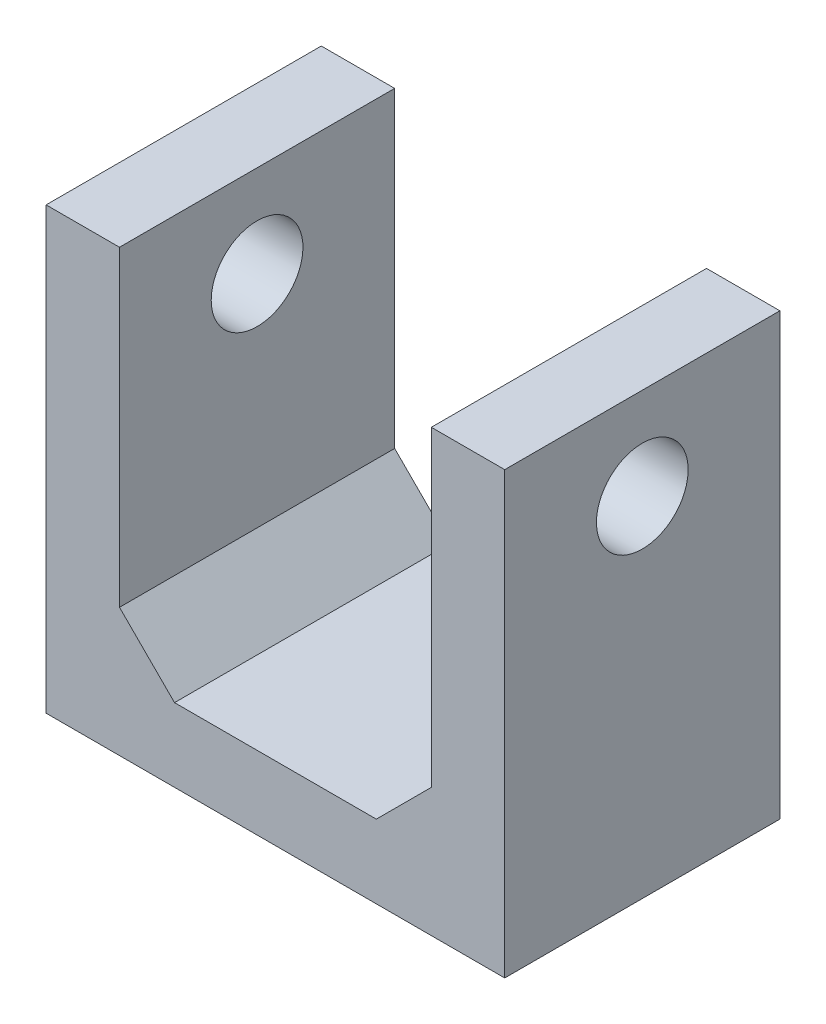
ISO-10303-21;
HEADER;
FILE_DESCRIPTION(('STEP AP214'),'2;1');
FILE_NAME('part.step','',(''),(''),'','','');
FILE_SCHEMA(('AUTOMOTIVE_DESIGN { 1 0 10303 214 1 1 1 1 }'));
ENDSEC;
DATA;
#1=APPLICATION_CONTEXT('core data for automotive mechanical design processes');
#2=APPLICATION_PROTOCOL_DEFINITION('international standard','automotive_design',2000,#1);
#3=PRODUCT_CONTEXT('',#1,'mechanical');
#4=PRODUCT('Part','Part','',(#3));
#5=PRODUCT_RELATED_PRODUCT_CATEGORY('part','',(#4));
#6=PRODUCT_DEFINITION_FORMATION('','',#4);
#7=PRODUCT_DEFINITION_CONTEXT('part definition',#1,'design');
#8=PRODUCT_DEFINITION('design','',#6,#7);
#9=PRODUCT_DEFINITION_SHAPE('','',#8);
#10=(LENGTH_UNIT() NAMED_UNIT(*) SI_UNIT(.MILLI.,.METRE.));
#11=(NAMED_UNIT(*) PLANE_ANGLE_UNIT() SI_UNIT($,.RADIAN.));
#12=(NAMED_UNIT(*) SI_UNIT($,.STERADIAN.) SOLID_ANGLE_UNIT());
#13=UNCERTAINTY_MEASURE_WITH_UNIT(LENGTH_MEASURE(1.E-05),#10,'distance_accuracy_value','');
#14=(GEOMETRIC_REPRESENTATION_CONTEXT(3) GLOBAL_UNCERTAINTY_ASSIGNED_CONTEXT((#13)) GLOBAL_UNIT_ASSIGNED_CONTEXT((#10,
#11,#12)) REPRESENTATION_CONTEXT('',''));
#15=CARTESIAN_POINT('',(0.,0.,0.));
#16=DIRECTION('',(0.,0.,1.));
#17=DIRECTION('',(1.,0.,0.));
#18=AXIS2_PLACEMENT_3D('',#15,#16,#17);
#19=CARTESIAN_POINT('',(0.,6.24929577464789,15.));
#20=DIRECTION('',(0.,1.,0.));
#21=DIRECTION('',(0.,0.,1.));
#22=AXIS2_PLACEMENT_3D('',#19,#20,#21);
#23=PLANE('',#22);
#24=DIRECTION('',(1.,0.,0.));
#25=VECTOR('',#24,1.);
#26=CARTESIAN_POINT('',(0.,6.24929577464789,0.));
#27=LINE('',#26,#25);
#28=CARTESIAN_POINT('',(8.11788248873083,6.24929577464789,0.));
#29=VERTEX_POINT('',#28);
#30=CARTESIAN_POINT('',(12.1178824887308,6.24929577464789,0.));
#31=VERTEX_POINT('',#30);
#32=EDGE_CURVE('E132',#29,#31,#27,.T.);
#33=ORIENTED_EDGE('',*,*,#32,.F.);
#34=DIRECTION('',(0.,0.,-1.));
#35=VECTOR('',#34,1.);
#36=CARTESIAN_POINT('',(8.11788248873083,6.24929577464789,15.));
#37=LINE('',#36,#35);
#38=CARTESIAN_POINT('',(8.11788248873083,6.24929577464789,15.));
#39=VERTEX_POINT('',#38);
#40=EDGE_CURVE('E127',#39,#29,#37,.T.);
#41=ORIENTED_EDGE('',*,*,#40,.F.);
#42=DIRECTION('',(1.,0.,0.));
#43=VECTOR('',#42,1.);
#44=CARTESIAN_POINT('',(0.,6.24929577464789,15.));
#45=LINE('',#44,#43);
#46=CARTESIAN_POINT('',(12.1178824887308,6.24929577464789,15.));
#47=VERTEX_POINT('',#46);
#48=EDGE_CURVE('E129',#39,#47,#45,.T.);
#49=ORIENTED_EDGE('',*,*,#48,.T.);
#50=DIRECTION('',(0.,0.,-1.));
#51=VECTOR('',#50,1.);
#52=CARTESIAN_POINT('',(12.1178824887308,6.24929577464789,15.));
#53=LINE('',#52,#51);
#54=EDGE_CURVE('E177',#47,#31,#53,.T.);
#55=ORIENTED_EDGE('',*,*,#54,.T.);
#56=EDGE_LOOP('',(#33,#41,#49,#55));
#57=FACE_BOUND('',#56,.T.);
#58=ADVANCED_FACE('F47',(#57),#23,.T.);
#59=CARTESIAN_POINT('',(8.11788248873083,0.,15.));
#60=DIRECTION('',(1.,0.,0.));
#61=DIRECTION('',(0.,1.,0.));
#62=AXIS2_PLACEMENT_3D('',#59,#60,#61);
#63=PLANE('',#62);
#64=CARTESIAN_POINT('',(8.11788248873083,1.24929577464789,7.5));
#65=DIRECTION('',(1.,0.,0.));
#66=DIRECTION('',(0.,1.,0.));
#67=AXIS2_PLACEMENT_3D('',#64,#65,#66);
#68=CIRCLE('',#67,2.5);
#69=CARTESIAN_POINT('',(8.11788248873083,3.74929577464789,7.5));
#70=VERTEX_POINT('',#69);
#71=EDGE_CURVE('E155',#70,#70,#68,.T.);
#72=ORIENTED_EDGE('',*,*,#71,.T.);
#73=EDGE_LOOP('',(#72));
#74=FACE_BOUND('',#73,.T.);
#75=DIRECTION('',(0.,-1.,0.));
#76=VECTOR('',#75,1.);
#77=CARTESIAN_POINT('',(8.11788248873083,0.,0.));
#78=LINE('',#77,#76);
#79=CARTESIAN_POINT('',(8.11788248873084,-10.7507042253521,0.));
#80=VERTEX_POINT('',#79);
#81=EDGE_CURVE('E180',#29,#80,#78,.T.);
#82=ORIENTED_EDGE('',*,*,#81,.T.);
#83=DIRECTION('',(0.,0.,1.));
#84=VECTOR('',#83,1.);
#85=CARTESIAN_POINT('',(8.11788248873084,-10.7507042253521,15.));
#86=LINE('',#85,#84);
#87=CARTESIAN_POINT('',(8.11788248873084,-10.7507042253521,15.));
#88=VERTEX_POINT('',#87);
#89=EDGE_CURVE('E65',#80,#88,#86,.T.);
#90=ORIENTED_EDGE('',*,*,#89,.T.);
#91=DIRECTION('',(0.,-1.,0.));
#92=VECTOR('',#91,1.);
#93=CARTESIAN_POINT('',(8.11788248873083,0.,15.));
#94=LINE('',#93,#92);
#95=EDGE_CURVE('E137',#39,#88,#94,.T.);
#96=ORIENTED_EDGE('',*,*,#95,.F.);
#97=ORIENTED_EDGE('',*,*,#40,.T.);
#98=EDGE_LOOP('',(#82,#90,#96,#97));
#99=FACE_BOUND('',#98,.T.);
#100=ADVANCED_FACE('F138',(#74,#99),#63,.F.);
#101=CARTESIAN_POINT('',(0.,-13.7507042253521,15.));
#102=DIRECTION('',(0.,1.,0.));
#103=DIRECTION('',(0.,0.,1.));
#104=AXIS2_PLACEMENT_3D('',#101,#102,#103);
#105=PLANE('',#104);
#106=DIRECTION('',(1.,0.,0.));
#107=VECTOR('',#106,1.);
#108=CARTESIAN_POINT('',(0.,-13.7507042253521,15.));
#109=LINE('',#108,#107);
#110=CARTESIAN_POINT('',(-5.88211751126918,-13.7507042253521,15.));
#111=VERTEX_POINT('',#110);
#112=CARTESIAN_POINT('',(5.11788248873081,-13.7507042253521,15.));
#113=VERTEX_POINT('',#112);
#114=EDGE_CURVE('E142',#111,#113,#109,.T.);
#115=ORIENTED_EDGE('',*,*,#114,.T.);
#116=DIRECTION('',(0.,0.,-1.));
#117=VECTOR('',#116,1.);
#118=CARTESIAN_POINT('',(5.11788248873081,-13.7507042253521,15.));
#119=LINE('',#118,#117);
#120=CARTESIAN_POINT('',(5.11788248873081,-13.7507042253521,0.));
#121=VERTEX_POINT('',#120);
#122=EDGE_CURVE('E226',#113,#121,#119,.T.);
#123=ORIENTED_EDGE('',*,*,#122,.T.);
#124=DIRECTION('',(1.,0.,0.));
#125=VECTOR('',#124,1.);
#126=CARTESIAN_POINT('',(0.,-13.7507042253521,0.));
#127=LINE('',#126,#125);
#128=CARTESIAN_POINT('',(-5.88211751126918,-13.7507042253521,0.));
#129=VERTEX_POINT('',#128);
#130=EDGE_CURVE('E183',#129,#121,#127,.T.);
#131=ORIENTED_EDGE('',*,*,#130,.F.);
#132=DIRECTION('',(0.,0.,1.));
#133=VECTOR('',#132,1.);
#134=CARTESIAN_POINT('',(-5.88211751126918,-13.7507042253521,15.));
#135=LINE('',#134,#133);
#136=EDGE_CURVE('E217',#129,#111,#135,.T.);
#137=ORIENTED_EDGE('',*,*,#136,.T.);
#138=EDGE_LOOP('',(#115,#123,#131,#137));
#139=FACE_BOUND('',#138,.T.);
#140=ADVANCED_FACE('F236',(#139),#105,.T.);
#141=CARTESIAN_POINT('',(-8.88211751126917,0.,15.));
#142=DIRECTION('',(1.,0.,0.));
#143=DIRECTION('',(0.,1.,0.));
#144=AXIS2_PLACEMENT_3D('',#141,#142,#143);
#145=PLANE('',#144);
#146=CARTESIAN_POINT('',(-8.88211751126917,1.24929577464789,7.5));
#147=DIRECTION('',(1.,0.,0.));
#148=DIRECTION('',(0.,1.,0.));
#149=AXIS2_PLACEMENT_3D('',#146,#147,#148);
#150=CIRCLE('',#149,2.5);
#151=CARTESIAN_POINT('',(-8.88211751126917,3.74929577464789,7.5));
#152=VERTEX_POINT('',#151);
#153=EDGE_CURVE('E383',#152,#152,#150,.T.);
#154=ORIENTED_EDGE('',*,*,#153,.F.);
#155=EDGE_LOOP('',(#154));
#156=FACE_BOUND('',#155,.T.);
#157=DIRECTION('',(0.,-1.,0.));
#158=VECTOR('',#157,1.);
#159=CARTESIAN_POINT('',(-8.88211751126917,0.,15.));
#160=LINE('',#159,#158);
#161=CARTESIAN_POINT('',(-8.88211751126917,6.24929577464789,15.));
#162=VERTEX_POINT('',#161);
#163=CARTESIAN_POINT('',(-8.88211751126917,-10.7507042253521,15.));
#164=VERTEX_POINT('',#163);
#165=EDGE_CURVE('E161',#162,#164,#160,.T.);
#166=ORIENTED_EDGE('',*,*,#165,.T.);
#167=DIRECTION('',(0.,0.,-1.));
#168=VECTOR('',#167,1.);
#169=CARTESIAN_POINT('',(-8.88211751126917,-10.7507042253521,0.));
#170=LINE('',#169,#168);
#171=CARTESIAN_POINT('',(-8.88211751126917,-10.7507042253521,0.));
#172=VERTEX_POINT('',#171);
#173=EDGE_CURVE('E134',#164,#172,#170,.T.);
#174=ORIENTED_EDGE('',*,*,#173,.T.);
#175=DIRECTION('',(0.,-1.,0.));
#176=VECTOR('',#175,1.);
#177=CARTESIAN_POINT('',(-8.88211751126917,0.,0.));
#178=LINE('',#177,#176);
#179=CARTESIAN_POINT('',(-8.88211751126917,6.24929577464789,0.));
#180=VERTEX_POINT('',#179);
#181=EDGE_CURVE('E186',#180,#172,#178,.T.);
#182=ORIENTED_EDGE('',*,*,#181,.F.);
#183=DIRECTION('',(0.,0.,-1.));
#184=VECTOR('',#183,1.);
#185=CARTESIAN_POINT('',(-8.88211751126917,6.24929577464789,15.));
#186=LINE('',#185,#184);
#187=EDGE_CURVE('E135',#162,#180,#186,.T.);
#188=ORIENTED_EDGE('',*,*,#187,.F.);
#189=EDGE_LOOP('',(#166,#174,#182,#188));
#190=FACE_BOUND('',#189,.T.);
#191=ADVANCED_FACE('F247',(#156,#190),#145,.T.);
#192=CARTESIAN_POINT('',(0.,6.24929577464789,15.));
#193=DIRECTION('',(0.,1.,0.));
#194=DIRECTION('',(-1.,0.,0.));
#195=AXIS2_PLACEMENT_3D('',#192,#193,#194);
#196=PLANE('',#195);
#197=DIRECTION('',(1.,0.,0.));
#198=VECTOR('',#197,1.);
#199=CARTESIAN_POINT('',(0.,6.24929577464789,0.));
#200=LINE('',#199,#198);
#201=CARTESIAN_POINT('',(-12.8821175112692,6.24929577464789,0.));
#202=VERTEX_POINT('',#201);
#203=EDGE_CURVE('E190',#202,#180,#200,.T.);
#204=ORIENTED_EDGE('',*,*,#203,.F.);
#205=DIRECTION('',(0.,0.,-1.));
#206=VECTOR('',#205,1.);
#207=CARTESIAN_POINT('',(-12.8821175112692,6.24929577464789,15.));
#208=LINE('',#207,#206);
#209=CARTESIAN_POINT('',(-12.8821175112692,6.24929577464789,15.));
#210=VERTEX_POINT('',#209);
#211=EDGE_CURVE('E209',#210,#202,#208,.T.);
#212=ORIENTED_EDGE('',*,*,#211,.F.);
#213=DIRECTION('',(1.,0.,0.));
#214=VECTOR('',#213,1.);
#215=CARTESIAN_POINT('',(0.,6.24929577464789,15.));
#216=LINE('',#215,#214);
#217=EDGE_CURVE('E165',#210,#162,#216,.T.);
#218=ORIENTED_EDGE('',*,*,#217,.T.);
#219=ORIENTED_EDGE('',*,*,#187,.T.);
#220=EDGE_LOOP('',(#204,#212,#218,#219));
#221=FACE_BOUND('',#220,.T.);
#222=ADVANCED_FACE('F252',(#221),#196,.T.);
#223=CARTESIAN_POINT('',(-12.8821175112692,0.,15.));
#224=DIRECTION('',(1.,0.,0.));
#225=DIRECTION('',(0.,1.,0.));
#226=AXIS2_PLACEMENT_3D('',#223,#224,#225);
#227=PLANE('',#226);
#228=CARTESIAN_POINT('',(-12.8821175112692,1.24929577464789,7.5));
#229=DIRECTION('',(-1.,0.,0.));
#230=DIRECTION('',(0.,0.,1.));
#231=AXIS2_PLACEMENT_3D('',#228,#229,#230);
#232=CIRCLE('',#231,2.5);
#233=CARTESIAN_POINT('',(-12.8821175112692,1.24929577464789,10.));
#234=VERTEX_POINT('',#233);
#235=EDGE_CURVE('E377',#234,#234,#232,.T.);
#236=ORIENTED_EDGE('',*,*,#235,.F.);
#237=EDGE_LOOP('',(#236));
#238=FACE_BOUND('',#237,.T.);
#239=DIRECTION('',(0.,-1.,0.));
#240=VECTOR('',#239,1.);
#241=CARTESIAN_POINT('',(-12.8821175112692,0.,0.));
#242=LINE('',#241,#240);
#243=CARTESIAN_POINT('',(-12.8821175112692,-17.7507042253521,0.));
#244=VERTEX_POINT('',#243);
#245=EDGE_CURVE('E194',#202,#244,#242,.T.);
#246=ORIENTED_EDGE('',*,*,#245,.T.);
#247=DIRECTION('',(0.,0.,-1.));
#248=VECTOR('',#247,1.);
#249=CARTESIAN_POINT('',(-12.8821175112692,-17.7507042253521,15.));
#250=LINE('',#249,#248);
#251=CARTESIAN_POINT('',(-12.8821175112692,-17.7507042253521,15.));
#252=VERTEX_POINT('',#251);
#253=EDGE_CURVE('E205',#252,#244,#250,.T.);
#254=ORIENTED_EDGE('',*,*,#253,.F.);
#255=DIRECTION('',(0.,-1.,0.));
#256=VECTOR('',#255,1.);
#257=CARTESIAN_POINT('',(-12.8821175112692,0.,15.));
#258=LINE('',#257,#256);
#259=EDGE_CURVE('E169',#210,#252,#258,.T.);
#260=ORIENTED_EDGE('',*,*,#259,.F.);
#261=ORIENTED_EDGE('',*,*,#211,.T.);
#262=EDGE_LOOP('',(#246,#254,#260,#261));
#263=FACE_BOUND('',#262,.T.);
#264=ADVANCED_FACE('F257',(#238,#263),#227,.F.);
#265=CARTESIAN_POINT('',(0.,-17.7507042253521,15.));
#266=DIRECTION('',(0.,1.,0.));
#267=DIRECTION('',(0.,0.,1.));
#268=AXIS2_PLACEMENT_3D('',#265,#266,#267);
#269=PLANE('',#268);
#270=CARTESIAN_POINT('',(-9.88211751126917,-17.7507042253521,3.));
#271=DIRECTION('',(0.,-1.,0.));
#272=DIRECTION('',(0.,0.,1.));
#273=AXIS2_PLACEMENT_3D('',#270,#271,#272);
#274=CIRCLE('',#273,1.5);
#275=CARTESIAN_POINT('',(-9.88211751126917,-17.7507042253521,4.5));
#276=VERTEX_POINT('',#275);
#277=EDGE_CURVE('E361',#276,#276,#274,.T.);
#278=ORIENTED_EDGE('',*,*,#277,.F.);
#279=EDGE_LOOP('',(#278));
#280=FACE_BOUND('',#279,.T.);
#281=CARTESIAN_POINT('',(9.11788248873084,-17.7507042253521,12.));
#282=DIRECTION('',(0.,-1.,0.));
#283=DIRECTION('',(0.,0.,1.));
#284=AXIS2_PLACEMENT_3D('',#281,#282,#283);
#285=CIRCLE('',#284,1.5);
#286=CARTESIAN_POINT('',(9.11788248873084,-17.7507042253521,13.5));
#287=VERTEX_POINT('',#286);
#288=EDGE_CURVE('E357',#287,#287,#285,.T.);
#289=ORIENTED_EDGE('',*,*,#288,.F.);
#290=EDGE_LOOP('',(#289));
#291=FACE_BOUND('',#290,.T.);
#292=CARTESIAN_POINT('',(9.11788248873084,-17.7507042253521,3.));
#293=DIRECTION('',(0.,-1.,0.));
#294=DIRECTION('',(0.,0.,-1.));
#295=AXIS2_PLACEMENT_3D('',#292,#293,#294);
#296=CIRCLE('',#295,1.5);
#297=CARTESIAN_POINT('',(9.11788248873084,-17.7507042253521,1.5));
#298=VERTEX_POINT('',#297);
#299=EDGE_CURVE('E349',#298,#298,#296,.T.);
#300=ORIENTED_EDGE('',*,*,#299,.F.);
#301=EDGE_LOOP('',(#300));
#302=FACE_BOUND('',#301,.T.);
#303=CARTESIAN_POINT('',(-9.88211751126917,-17.7507042253521,12.));
#304=DIRECTION('',(0.,-1.,0.));
#305=DIRECTION('',(0.,0.,-1.));
#306=AXIS2_PLACEMENT_3D('',#303,#304,#305);
#307=CIRCLE('',#306,1.5);
#308=CARTESIAN_POINT('',(-9.88211751126917,-17.7507042253521,10.5));
#309=VERTEX_POINT('',#308);
#310=EDGE_CURVE('E365',#309,#309,#307,.T.);
#311=ORIENTED_EDGE('',*,*,#310,.F.);
#312=EDGE_LOOP('',(#311));
#313=FACE_BOUND('',#312,.T.);
#314=DIRECTION('',(1.,0.,0.));
#315=VECTOR('',#314,1.);
#316=CARTESIAN_POINT('',(0.,-17.7507042253521,0.));
#317=LINE('',#316,#315);
#318=CARTESIAN_POINT('',(12.1178824887308,-17.7507042253521,0.));
#319=VERTEX_POINT('',#318);
#320=EDGE_CURVE('E152',#244,#319,#317,.T.);
#321=ORIENTED_EDGE('',*,*,#320,.T.);
#322=DIRECTION('',(0.,0.,-1.));
#323=VECTOR('',#322,1.);
#324=CARTESIAN_POINT('',(12.1178824887308,-17.7507042253521,15.));
#325=LINE('',#324,#323);
#326=CARTESIAN_POINT('',(12.1178824887308,-17.7507042253521,15.));
#327=VERTEX_POINT('',#326);
#328=EDGE_CURVE('E202',#327,#319,#325,.T.);
#329=ORIENTED_EDGE('',*,*,#328,.F.);
#330=DIRECTION('',(1.,0.,0.));
#331=VECTOR('',#330,1.);
#332=CARTESIAN_POINT('',(0.,-17.7507042253521,15.));
#333=LINE('',#332,#331);
#334=EDGE_CURVE('E172',#252,#327,#333,.T.);
#335=ORIENTED_EDGE('',*,*,#334,.F.);
#336=ORIENTED_EDGE('',*,*,#253,.T.);
#337=EDGE_LOOP('',(#321,#329,#335,#336));
#338=FACE_BOUND('',#337,.T.);
#339=ADVANCED_FACE('F261',(#280,#291,#302,#313,#338),#269,.F.);
#340=CARTESIAN_POINT('',(12.1178824887308,0.,15.));
#341=DIRECTION('',(1.,0.,0.));
#342=DIRECTION('',(0.,1.,0.));
#343=AXIS2_PLACEMENT_3D('',#340,#341,#342);
#344=PLANE('',#343);
#345=CARTESIAN_POINT('',(12.1178824887308,1.24929577464789,7.5));
#346=DIRECTION('',(1.,0.,0.));
#347=DIRECTION('',(0.,1.,0.));
#348=AXIS2_PLACEMENT_3D('',#345,#346,#347);
#349=CIRCLE('',#348,2.5);
#350=CARTESIAN_POINT('',(12.1178824887308,3.74929577464789,7.5));
#351=VERTEX_POINT('',#350);
#352=EDGE_CURVE('E52',#351,#351,#349,.T.);
#353=ORIENTED_EDGE('',*,*,#352,.F.);
#354=EDGE_LOOP('',(#353));
#355=FACE_BOUND('',#354,.T.);
#356=DIRECTION('',(0.,-1.,0.));
#357=VECTOR('',#356,1.);
#358=CARTESIAN_POINT('',(12.1178824887308,0.,0.));
#359=LINE('',#358,#357);
#360=EDGE_CURVE('E148',#31,#319,#359,.T.);
#361=ORIENTED_EDGE('',*,*,#360,.F.);
#362=ORIENTED_EDGE('',*,*,#54,.F.);
#363=DIRECTION('',(0.,-1.,0.));
#364=VECTOR('',#363,1.);
#365=CARTESIAN_POINT('',(12.1178824887308,0.,15.));
#366=LINE('',#365,#364);
#367=EDGE_CURVE('E146',#47,#327,#366,.T.);
#368=ORIENTED_EDGE('',*,*,#367,.T.);
#369=ORIENTED_EDGE('',*,*,#328,.T.);
#370=EDGE_LOOP('',(#361,#362,#368,#369));
#371=FACE_BOUND('',#370,.T.);
#372=ADVANCED_FACE('F265',(#355,#371),#344,.T.);
#373=CARTESIAN_POINT('',(0.,0.,15.));
#374=DIRECTION('',(0.,0.,1.));
#375=DIRECTION('',(1.,0.,0.));
#376=AXIS2_PLACEMENT_3D('',#373,#374,#375);
#377=PLANE('',#376);
#378=ORIENTED_EDGE('',*,*,#48,.F.);
#379=ORIENTED_EDGE('',*,*,#95,.T.);
#380=DIRECTION('',(-0.707106781186551,-0.707106781186544,0.));
#381=VECTOR('',#380,1.);
#382=CARTESIAN_POINT('',(5.11788248873081,-13.7507042253521,15.));
#383=LINE('',#382,#381);
#384=EDGE_CURVE('E11',#88,#113,#383,.T.);
#385=ORIENTED_EDGE('',*,*,#384,.T.);
#386=ORIENTED_EDGE('',*,*,#114,.F.);
#387=DIRECTION('',(0.707106781186544,-0.707106781186551,0.));
#388=VECTOR('',#387,1.);
#389=CARTESIAN_POINT('',(-8.88211751126917,-10.7507042253521,15.));
#390=LINE('',#389,#388);
#391=EDGE_CURVE('E223',#111,#164,#390,.F.);
#392=ORIENTED_EDGE('',*,*,#391,.T.);
#393=ORIENTED_EDGE('',*,*,#165,.F.);
#394=ORIENTED_EDGE('',*,*,#217,.F.);
#395=ORIENTED_EDGE('',*,*,#259,.T.);
#396=ORIENTED_EDGE('',*,*,#334,.T.);
#397=ORIENTED_EDGE('',*,*,#367,.F.);
#398=EDGE_LOOP('',(#378,#379,#385,#386,#392,#393,#394,#395,#396,#397));
#399=FACE_BOUND('',#398,.T.);
#400=ADVANCED_FACE('F144',(#399),#377,.T.);
#401=CARTESIAN_POINT('',(0.,0.,0.));
#402=DIRECTION('',(0.,0.,1.));
#403=DIRECTION('',(1.,0.,0.));
#404=AXIS2_PLACEMENT_3D('',#401,#402,#403);
#405=PLANE('',#404);
#406=ORIENTED_EDGE('',*,*,#32,.T.);
#407=ORIENTED_EDGE('',*,*,#360,.T.);
#408=ORIENTED_EDGE('',*,*,#320,.F.);
#409=ORIENTED_EDGE('',*,*,#245,.F.);
#410=ORIENTED_EDGE('',*,*,#203,.T.);
#411=ORIENTED_EDGE('',*,*,#181,.T.);
#412=DIRECTION('',(-0.707106781186544,0.707106781186551,0.));
#413=VECTOR('',#412,1.);
#414=CARTESIAN_POINT('',(-9.81641086831067,-9.81641086831057,0.));
#415=LINE('',#414,#413);
#416=EDGE_CURVE('E220',#172,#129,#415,.F.);
#417=ORIENTED_EDGE('',*,*,#416,.T.);
#418=ORIENTED_EDGE('',*,*,#130,.T.);
#419=DIRECTION('',(0.707106781186551,0.707106781186544,0.));
#420=VECTOR('',#419,1.);
#421=CARTESIAN_POINT('',(9.43429335704143,-9.43429335704153,0.));
#422=LINE('',#421,#420);
#423=EDGE_CURVE('E58',#121,#80,#422,.T.);
#424=ORIENTED_EDGE('',*,*,#423,.T.);
#425=ORIENTED_EDGE('',*,*,#81,.F.);
#426=EDGE_LOOP('',(#406,#407,#408,#409,#410,#411,#417,#418,#424,#425));
#427=FACE_BOUND('',#426,.T.);
#428=ADVANCED_FACE('F240',(#427),#405,.F.);
#429=CARTESIAN_POINT('',(-8.88211751126917,-10.7507042253521,15.));
#430=DIRECTION('',(0.707106781186551,0.707106781186544,0.));
#431=DIRECTION('',(0.,0.,1.));
#432=AXIS2_PLACEMENT_3D('',#429,#430,#431);
#433=PLANE('',#432);
#434=ORIENTED_EDGE('',*,*,#391,.F.);
#435=ORIENTED_EDGE('',*,*,#136,.F.);
#436=ORIENTED_EDGE('',*,*,#416,.F.);
#437=ORIENTED_EDGE('',*,*,#173,.F.);
#438=EDGE_LOOP('',(#434,#435,#436,#437));
#439=FACE_BOUND('',#438,.T.);
#440=ADVANCED_FACE('F245',(#439),#433,.T.);
#441=CARTESIAN_POINT('',(5.11788248873081,-13.7507042253521,15.));
#442=DIRECTION('',(0.707106781186544,-0.707106781186551,0.));
#443=DIRECTION('',(0.,0.,-1.));
#444=AXIS2_PLACEMENT_3D('',#441,#442,#443);
#445=PLANE('',#444);
#446=ORIENTED_EDGE('',*,*,#384,.F.);
#447=ORIENTED_EDGE('',*,*,#89,.F.);
#448=ORIENTED_EDGE('',*,*,#423,.F.);
#449=ORIENTED_EDGE('',*,*,#122,.F.);
#450=EDGE_LOOP('',(#446,#447,#448,#449));
#451=FACE_BOUND('',#450,.T.);
#452=ADVANCED_FACE('F50',(#451),#445,.F.);
#453=CARTESIAN_POINT('',(24.1178824887308,1.24929577464789,7.5));
#454=DIRECTION('',(-1.,0.,0.));
#455=DIRECTION('',(0.,0.,1.));
#456=AXIS2_PLACEMENT_3D('',#453,#454,#455);
#457=CYLINDRICAL_SURFACE('',#456,2.5);
#458=ORIENTED_EDGE('',*,*,#352,.T.);
#459=EDGE_LOOP('',(#458));
#460=FACE_BOUND('',#459,.T.);
#461=ORIENTED_EDGE('',*,*,#71,.F.);
#462=EDGE_LOOP('',(#461));
#463=FACE_BOUND('',#462,.T.);
#464=ADVANCED_FACE('F267',(#460,#463),#457,.F.);
#465=ORIENTED_EDGE('',*,*,#153,.T.);
#466=EDGE_LOOP('',(#465));
#467=FACE_BOUND('',#466,.T.);
#468=ORIENTED_EDGE('',*,*,#235,.T.);
#469=EDGE_LOOP('',(#468));
#470=FACE_BOUND('',#469,.T.);
#471=ADVANCED_FACE('F272',(#467,#470),#457,.F.);
#472=CARTESIAN_POINT('',(-9.88211751126917,-11.7507042253521,12.));
#473=DIRECTION('',(0.,-1.,0.));
#474=DIRECTION('',(0.,0.,-1.));
#475=AXIS2_PLACEMENT_3D('',#472,#473,#474);
#476=CYLINDRICAL_SURFACE('',#475,1.5);
#477=CARTESIAN_POINT('',(-9.88211751126917,-11.7507042253521,12.));
#478=DIRECTION('',(0.,-1.,0.));
#479=DIRECTION('',(0.,0.,-1.));
#480=AXIS2_PLACEMENT_3D('',#477,#478,#479);
#481=CIRCLE('',#480,1.5);
#482=CARTESIAN_POINT('',(-9.88211751126917,-11.7507042253521,10.5));
#483=VERTEX_POINT('',#482);
#484=EDGE_CURVE('E373',#483,#483,#481,.T.);
#485=ORIENTED_EDGE('',*,*,#484,.F.);
#486=EDGE_LOOP('',(#485));
#487=FACE_BOUND('',#486,.T.);
#488=ORIENTED_EDGE('',*,*,#310,.T.);
#489=EDGE_LOOP('',(#488));
#490=FACE_BOUND('',#489,.T.);
#491=ADVANCED_FACE('F309',(#487,#490),#476,.F.);
#492=CARTESIAN_POINT('',(-9.88211751126917,-11.7507042253521,12.));
#493=DIRECTION('',(0.,-1.,0.));
#494=DIRECTION('',(0.,0.,-1.));
#495=AXIS2_PLACEMENT_3D('',#492,#493,#494);
#496=PLANE('',#495);
#497=ORIENTED_EDGE('',*,*,#484,.T.);
#498=EDGE_LOOP('',(#497));
#499=FACE_BOUND('',#498,.T.);
#500=ADVANCED_FACE('F313',(#499),#496,.T.);
#501=CARTESIAN_POINT('',(9.11788248873084,-11.7507042253521,3.));
#502=DIRECTION('',(0.,-1.,0.));
#503=DIRECTION('',(0.,0.,-1.));
#504=AXIS2_PLACEMENT_3D('',#501,#502,#503);
#505=CYLINDRICAL_SURFACE('',#504,1.5);
#506=CARTESIAN_POINT('',(9.11788248873084,-11.7507042253521,3.));
#507=DIRECTION('',(0.,-1.,0.));
#508=DIRECTION('',(0.,0.,-1.));
#509=AXIS2_PLACEMENT_3D('',#506,#507,#508);
#510=CIRCLE('',#509,1.5);
#511=CARTESIAN_POINT('',(9.11788248873084,-11.7507042253521,1.5));
#512=VERTEX_POINT('',#511);
#513=EDGE_CURVE('E346',#512,#512,#510,.T.);
#514=ORIENTED_EDGE('',*,*,#513,.F.);
#515=EDGE_LOOP('',(#514));
#516=FACE_BOUND('',#515,.T.);
#517=ORIENTED_EDGE('',*,*,#299,.T.);
#518=EDGE_LOOP('',(#517));
#519=FACE_BOUND('',#518,.T.);
#520=ADVANCED_FACE('F317',(#516,#519),#505,.F.);
#521=CARTESIAN_POINT('',(9.11788248873084,-11.7507042253521,3.));
#522=DIRECTION('',(0.,-1.,0.));
#523=DIRECTION('',(0.,0.,-1.));
#524=AXIS2_PLACEMENT_3D('',#521,#522,#523);
#525=PLANE('',#524);
#526=ORIENTED_EDGE('',*,*,#513,.T.);
#527=EDGE_LOOP('',(#526));
#528=FACE_BOUND('',#527,.T.);
#529=ADVANCED_FACE('F327',(#528),#525,.T.);
#530=CARTESIAN_POINT('',(9.11788248873084,-11.7507042253521,12.));
#531=DIRECTION('',(0.,-1.,0.));
#532=DIRECTION('',(0.,0.,-1.));
#533=AXIS2_PLACEMENT_3D('',#530,#531,#532);
#534=CYLINDRICAL_SURFACE('',#533,1.5);
#535=CARTESIAN_POINT('',(9.11788248873084,-11.7507042253521,12.));
#536=DIRECTION('',(0.,-1.,0.));
#537=DIRECTION('',(0.,0.,1.));
#538=AXIS2_PLACEMENT_3D('',#535,#536,#537);
#539=CIRCLE('',#538,1.5);
#540=CARTESIAN_POINT('',(9.11788248873084,-11.7507042253521,13.5));
#541=VERTEX_POINT('',#540);
#542=EDGE_CURVE('E352',#541,#541,#539,.T.);
#543=ORIENTED_EDGE('',*,*,#542,.F.);
#544=EDGE_LOOP('',(#543));
#545=FACE_BOUND('',#544,.T.);
#546=ORIENTED_EDGE('',*,*,#288,.T.);
#547=EDGE_LOOP('',(#546));
#548=FACE_BOUND('',#547,.T.);
#549=ADVANCED_FACE('F323',(#545,#548),#534,.F.);
#550=CARTESIAN_POINT('',(9.11788248873084,-11.7507042253521,12.));
#551=DIRECTION('',(0.,1.,0.));
#552=DIRECTION('',(0.,0.,1.));
#553=AXIS2_PLACEMENT_3D('',#550,#551,#552);
#554=PLANE('',#553);
#555=ORIENTED_EDGE('',*,*,#542,.T.);
#556=EDGE_LOOP('',(#555));
#557=FACE_BOUND('',#556,.T.);
#558=ADVANCED_FACE('F319',(#557),#554,.F.);
#559=CARTESIAN_POINT('',(-9.88211751126917,-11.7507042253521,3.));
#560=DIRECTION('',(0.,-1.,0.));
#561=DIRECTION('',(0.,0.,-1.));
#562=AXIS2_PLACEMENT_3D('',#559,#560,#561);
#563=CYLINDRICAL_SURFACE('',#562,1.5);
#564=CARTESIAN_POINT('',(-9.88211751126917,-11.7507042253521,3.));
#565=DIRECTION('',(0.,-1.,0.));
#566=DIRECTION('',(0.,0.,1.));
#567=AXIS2_PLACEMENT_3D('',#564,#565,#566);
#568=CIRCLE('',#567,1.5);
#569=CARTESIAN_POINT('',(-9.88211751126917,-11.7507042253521,4.5));
#570=VERTEX_POINT('',#569);
#571=EDGE_CURVE('E366',#570,#570,#568,.T.);
#572=ORIENTED_EDGE('',*,*,#571,.F.);
#573=EDGE_LOOP('',(#572));
#574=FACE_BOUND('',#573,.T.);
#575=ORIENTED_EDGE('',*,*,#277,.T.);
#576=EDGE_LOOP('',(#575));
#577=FACE_BOUND('',#576,.T.);
#578=ADVANCED_FACE('F322',(#574,#577),#563,.F.);
#579=CARTESIAN_POINT('',(-9.88211751126917,-11.7507042253521,3.));
#580=DIRECTION('',(0.,1.,0.));
#581=DIRECTION('',(0.,0.,1.));
#582=AXIS2_PLACEMENT_3D('',#579,#580,#581);
#583=PLANE('',#582);
#584=ORIENTED_EDGE('',*,*,#571,.T.);
#585=EDGE_LOOP('',(#584));
#586=FACE_BOUND('',#585,.T.);
#587=ADVANCED_FACE('F329',(#586),#583,.F.);
#588=CLOSED_SHELL('',(#58,#100,#140,#191,#222,#264,#339,#372,#400,#428,#440,#452,#464,#471,#491,
#500,#520,#529,#549,#558,#578,#587));
#589=MANIFOLD_SOLID_BREP('B2',#588);
#590=ADVANCED_BREP_SHAPE_REPRESENTATION('',(#18,#589),#14);
#591=SHAPE_DEFINITION_REPRESENTATION(#9,#590);
ENDSEC;
END-ISO-10303-21;
